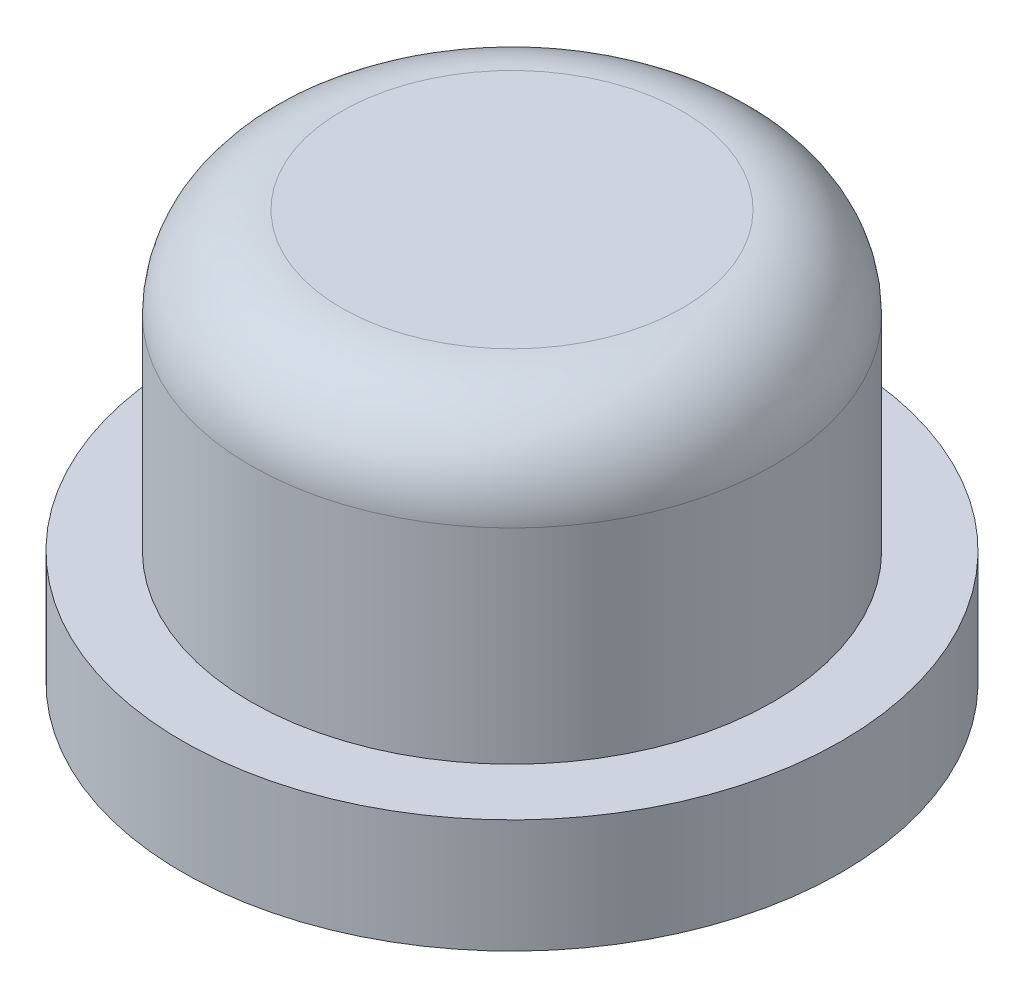
ISO-10303-21;
HEADER;
FILE_DESCRIPTION(('STEP AP214'),'2;1');
FILE_NAME('part.step','',(''),(''),'','','');
FILE_SCHEMA(('AUTOMOTIVE_DESIGN { 1 0 10303 214 1 1 1 1 }'));
ENDSEC;
DATA;
#1=APPLICATION_CONTEXT('core data for automotive mechanical design processes');
#2=APPLICATION_PROTOCOL_DEFINITION('international standard','automotive_design',2000,#1);
#3=PRODUCT_CONTEXT('',#1,'mechanical');
#4=PRODUCT('Part','Part','',(#3));
#5=PRODUCT_RELATED_PRODUCT_CATEGORY('part','',(#4));
#6=PRODUCT_DEFINITION_FORMATION('','',#4);
#7=PRODUCT_DEFINITION_CONTEXT('part definition',#1,'design');
#8=PRODUCT_DEFINITION('design','',#6,#7);
#9=PRODUCT_DEFINITION_SHAPE('','',#8);
#10=(LENGTH_UNIT() NAMED_UNIT(*) SI_UNIT(.MILLI.,.METRE.));
#11=(NAMED_UNIT(*) PLANE_ANGLE_UNIT() SI_UNIT($,.RADIAN.));
#12=(NAMED_UNIT(*) SI_UNIT($,.STERADIAN.) SOLID_ANGLE_UNIT());
#13=UNCERTAINTY_MEASURE_WITH_UNIT(LENGTH_MEASURE(1.E-05),#10,'distance_accuracy_value','');
#14=(GEOMETRIC_REPRESENTATION_CONTEXT(3) GLOBAL_UNCERTAINTY_ASSIGNED_CONTEXT((#13)) GLOBAL_UNIT_ASSIGNED_CONTEXT((#10,
#11,#12)) REPRESENTATION_CONTEXT('',''));
#15=CARTESIAN_POINT('',(0.,0.,0.));
#16=DIRECTION('',(0.,0.,1.));
#17=DIRECTION('',(1.,0.,0.));
#18=AXIS2_PLACEMENT_3D('',#15,#16,#17);
#19=CARTESIAN_POINT('',(0.,2.8,-3.85000282956601));
#20=DIRECTION('',(0.,-1.,0.));
#21=DIRECTION('',(1.,0.,0.));
#22=AXIS2_PLACEMENT_3D('',#19,#20,#21);
#23=TOROIDAL_SURFACE('',#22,1.5,0.800000000000002);
#24=CARTESIAN_POINT('',(0.,3.6,-3.85000282956601));
#25=DIRECTION('',(0.,-1.,0.));
#26=DIRECTION('',(1.,0.,0.));
#27=AXIS2_PLACEMENT_3D('',#24,#25,#26);
#28=CIRCLE('',#27,1.5);
#29=CARTESIAN_POINT('',(1.5,3.6,-3.85000282956601));
#30=VERTEX_POINT('',#29);
#31=EDGE_CURVE('E10',#30,#30,#28,.T.);
#32=ORIENTED_EDGE('',*,*,#31,.T.);
#33=EDGE_LOOP('',(#32));
#34=FACE_BOUND('',#33,.T.);
#35=CARTESIAN_POINT('',(0.,2.8,-3.85000282956601));
#36=DIRECTION('',(0.,-1.,0.));
#37=DIRECTION('',(1.,0.,0.));
#38=AXIS2_PLACEMENT_3D('',#35,#36,#37);
#39=CIRCLE('',#38,2.3);
#40=CARTESIAN_POINT('',(2.3,2.8,-3.85000282956601));
#41=VERTEX_POINT('',#40);
#42=EDGE_CURVE('E50',#41,#41,#39,.T.);
#43=ORIENTED_EDGE('',*,*,#42,.F.);
#44=EDGE_LOOP('',(#43));
#45=FACE_BOUND('',#44,.T.);
#46=ADVANCED_FACE('F31',(#34,#45),#23,.T.);
#47=CARTESIAN_POINT('',(1.5,3.6,-3.85000282956601));
#48=DIRECTION('',(0.,1.,0.));
#49=DIRECTION('',(-1.,0.,0.));
#50=AXIS2_PLACEMENT_3D('',#47,#48,#49);
#51=PLANE('',#50);
#52=ORIENTED_EDGE('',*,*,#31,.F.);
#53=EDGE_LOOP('',(#52));
#54=FACE_BOUND('',#53,.T.);
#55=ADVANCED_FACE('F72',(#54),#51,.T.);
#56=CARTESIAN_POINT('',(0.,0.,-3.85000282956601));
#57=DIRECTION('',(0.,-1.,0.));
#58=DIRECTION('',(1.,0.,0.));
#59=AXIS2_PLACEMENT_3D('',#56,#57,#58);
#60=PLANE('',#59);
#61=CARTESIAN_POINT('',(0.,0.,-3.85000282956601));
#62=DIRECTION('',(0.,-1.,0.));
#63=DIRECTION('',(1.,0.,0.));
#64=AXIS2_PLACEMENT_3D('',#61,#62,#63);
#65=CIRCLE('',#64,1.8);
#66=CARTESIAN_POINT('',(1.8,0.,-3.85000282956601));
#67=VERTEX_POINT('',#66);
#68=EDGE_CURVE('E54',#67,#67,#65,.T.);
#69=ORIENTED_EDGE('',*,*,#68,.F.);
#70=EDGE_LOOP('',(#69));
#71=FACE_BOUND('',#70,.T.);
#72=CARTESIAN_POINT('',(0.,0.,-3.85000282956601));
#73=DIRECTION('',(0.,-1.,0.));
#74=DIRECTION('',(1.,0.,0.));
#75=AXIS2_PLACEMENT_3D('',#72,#73,#74);
#76=CIRCLE('',#75,2.9);
#77=CARTESIAN_POINT('',(2.9,0.,-3.85000282956601));
#78=VERTEX_POINT('',#77);
#79=EDGE_CURVE('E37',#78,#78,#76,.T.);
#80=ORIENTED_EDGE('',*,*,#79,.T.);
#81=EDGE_LOOP('',(#80));
#82=FACE_BOUND('',#81,.T.);
#83=ADVANCED_FACE('F69',(#71,#82),#60,.T.);
#84=CARTESIAN_POINT('',(0.,3.6,-3.85000282956601));
#85=DIRECTION('',(0.,-1.,0.));
#86=DIRECTION('',(1.,0.,0.));
#87=AXIS2_PLACEMENT_3D('',#84,#85,#86);
#88=CYLINDRICAL_SURFACE('',#87,2.9);
#89=CARTESIAN_POINT('',(0.,1.,-3.85000282956601));
#90=DIRECTION('',(0.,-1.,0.));
#91=DIRECTION('',(1.,0.,0.));
#92=AXIS2_PLACEMENT_3D('',#89,#90,#91);
#93=CIRCLE('',#92,2.9);
#94=CARTESIAN_POINT('',(2.9,1.,-3.85000282956601));
#95=VERTEX_POINT('',#94);
#96=EDGE_CURVE('E41',#95,#95,#93,.T.);
#97=ORIENTED_EDGE('',*,*,#96,.T.);
#98=EDGE_LOOP('',(#97));
#99=FACE_BOUND('',#98,.T.);
#100=ORIENTED_EDGE('',*,*,#79,.F.);
#101=EDGE_LOOP('',(#100));
#102=FACE_BOUND('',#101,.T.);
#103=ADVANCED_FACE('F71',(#99,#102),#88,.T.);
#104=CARTESIAN_POINT('',(2.3,1.,-3.85000282956601));
#105=DIRECTION('',(0.,1.,0.));
#106=DIRECTION('',(-1.,0.,0.));
#107=AXIS2_PLACEMENT_3D('',#104,#105,#106);
#108=PLANE('',#107);
#109=CARTESIAN_POINT('',(0.,1.,-3.85000282956601));
#110=DIRECTION('',(0.,-1.,0.));
#111=DIRECTION('',(1.,0.,0.));
#112=AXIS2_PLACEMENT_3D('',#109,#110,#111);
#113=CIRCLE('',#112,2.3);
#114=CARTESIAN_POINT('',(2.3,1.,-3.85000282956601));
#115=VERTEX_POINT('',#114);
#116=EDGE_CURVE('E45',#115,#115,#113,.T.);
#117=ORIENTED_EDGE('',*,*,#116,.T.);
#118=EDGE_LOOP('',(#117));
#119=FACE_BOUND('',#118,.T.);
#120=ORIENTED_EDGE('',*,*,#96,.F.);
#121=EDGE_LOOP('',(#120));
#122=FACE_BOUND('',#121,.T.);
#123=ADVANCED_FACE('F78',(#119,#122),#108,.T.);
#124=CARTESIAN_POINT('',(0.,3.6,-3.85000282956601));
#125=DIRECTION('',(0.,-1.,0.));
#126=DIRECTION('',(1.,0.,0.));
#127=AXIS2_PLACEMENT_3D('',#124,#125,#126);
#128=CYLINDRICAL_SURFACE('',#127,2.3);
#129=ORIENTED_EDGE('',*,*,#42,.T.);
#130=EDGE_LOOP('',(#129));
#131=FACE_BOUND('',#130,.T.);
#132=ORIENTED_EDGE('',*,*,#116,.F.);
#133=EDGE_LOOP('',(#132));
#134=FACE_BOUND('',#133,.T.);
#135=ADVANCED_FACE('F65',(#131,#134),#128,.T.);
#136=CARTESIAN_POINT('',(0.,2.2,-3.85000282956601));
#137=DIRECTION('',(0.,-1.,0.));
#138=DIRECTION('',(1.,0.,0.));
#139=AXIS2_PLACEMENT_3D('',#136,#137,#138);
#140=CYLINDRICAL_SURFACE('',#139,1.8);
#141=CARTESIAN_POINT('',(0.,2.2,-3.85000282956601));
#142=DIRECTION('',(0.,-1.,0.));
#143=DIRECTION('',(1.,0.,0.));
#144=AXIS2_PLACEMENT_3D('',#141,#142,#143);
#145=CIRCLE('',#144,1.8);
#146=CARTESIAN_POINT('',(1.8,2.2,-3.85000282956601));
#147=VERTEX_POINT('',#146);
#148=EDGE_CURVE('E53',#147,#147,#145,.T.);
#149=ORIENTED_EDGE('',*,*,#148,.F.);
#150=EDGE_LOOP('',(#149));
#151=FACE_BOUND('',#150,.T.);
#152=ORIENTED_EDGE('',*,*,#68,.T.);
#153=EDGE_LOOP('',(#152));
#154=FACE_BOUND('',#153,.T.);
#155=ADVANCED_FACE('F62',(#151,#154),#140,.F.);
#156=CARTESIAN_POINT('',(0.,2.2,-3.85000282956601));
#157=DIRECTION('',(0.,-1.,0.));
#158=DIRECTION('',(1.,0.,0.));
#159=AXIS2_PLACEMENT_3D('',#156,#157,#158);
#160=PLANE('',#159);
#161=ORIENTED_EDGE('',*,*,#148,.T.);
#162=EDGE_LOOP('',(#161));
#163=FACE_BOUND('',#162,.T.);
#164=ADVANCED_FACE('F60',(#163),#160,.T.);
#165=CLOSED_SHELL('',(#46,#55,#83,#103,#123,#135,#155,#164));
#166=MANIFOLD_SOLID_BREP('B2',#165);
#167=ADVANCED_BREP_SHAPE_REPRESENTATION('',(#18,#166),#14);
#168=SHAPE_DEFINITION_REPRESENTATION(#9,#167);
ENDSEC;
END-ISO-10303-21;
